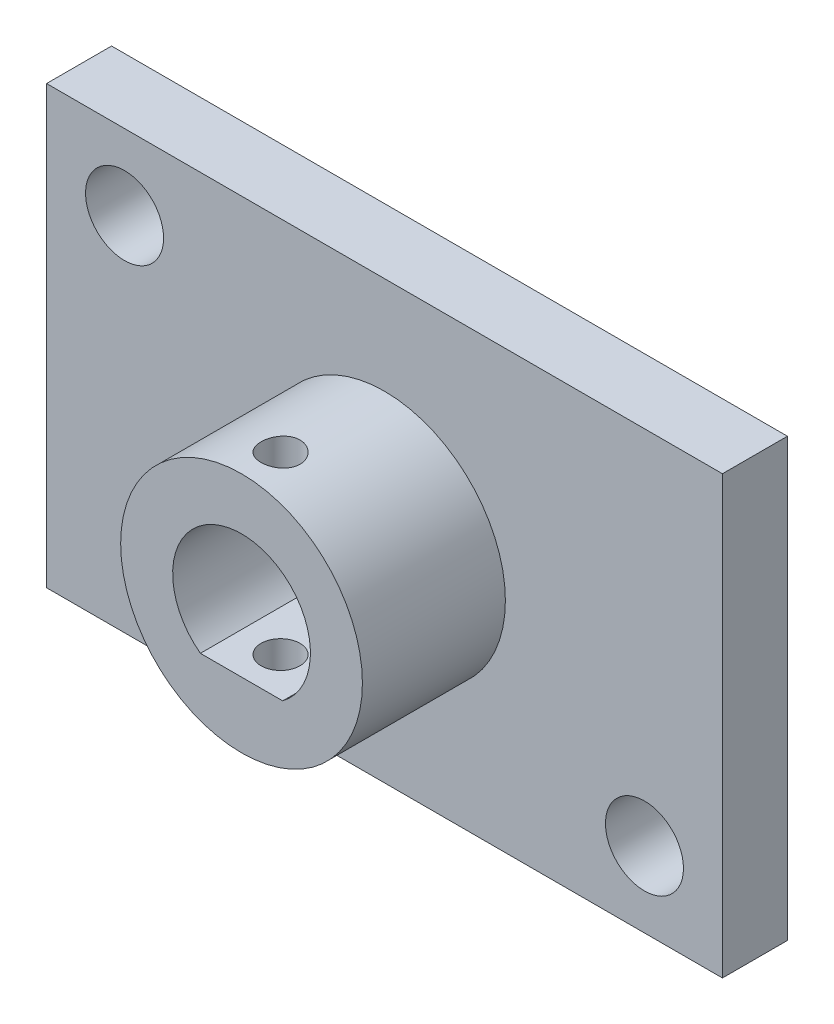
ISO-10303-21;
HEADER;
FILE_DESCRIPTION(('STEP AP214'),'2;1');
FILE_NAME('part.step','',(''),(''),'','','');
FILE_SCHEMA(('AUTOMOTIVE_DESIGN { 1 0 10303 214 1 1 1 1 }'));
ENDSEC;
DATA;
#1=APPLICATION_CONTEXT('core data for automotive mechanical design processes');
#2=APPLICATION_PROTOCOL_DEFINITION('international standard','automotive_design',2000,#1);
#3=PRODUCT_CONTEXT('',#1,'mechanical');
#4=PRODUCT('Part','Part','',(#3));
#5=PRODUCT_RELATED_PRODUCT_CATEGORY('part','',(#4));
#6=PRODUCT_DEFINITION_FORMATION('','',#4);
#7=PRODUCT_DEFINITION_CONTEXT('part definition',#1,'design');
#8=PRODUCT_DEFINITION('design','',#6,#7);
#9=PRODUCT_DEFINITION_SHAPE('','',#8);
#10=(LENGTH_UNIT() NAMED_UNIT(*) SI_UNIT(.MILLI.,.METRE.));
#11=(NAMED_UNIT(*) PLANE_ANGLE_UNIT() SI_UNIT($,.RADIAN.));
#12=(NAMED_UNIT(*) SI_UNIT($,.STERADIAN.) SOLID_ANGLE_UNIT());
#13=UNCERTAINTY_MEASURE_WITH_UNIT(LENGTH_MEASURE(1.E-05),#10,'distance_accuracy_value','');
#14=(GEOMETRIC_REPRESENTATION_CONTEXT(3) GLOBAL_UNCERTAINTY_ASSIGNED_CONTEXT((#13)) GLOBAL_UNIT_ASSIGNED_CONTEXT((#10,
#11,#12)) REPRESENTATION_CONTEXT('',''));
#15=CARTESIAN_POINT('',(0.,0.,0.));
#16=DIRECTION('',(0.,0.,1.));
#17=DIRECTION('',(1.,0.,0.));
#18=AXIS2_PLACEMENT_3D('',#15,#16,#17);
#19=CARTESIAN_POINT('',(0.,0.,16.));
#20=DIRECTION('',(0.,0.,-1.));
#21=DIRECTION('',(-1.,0.,0.));
#22=AXIS2_PLACEMENT_3D('',#19,#20,#21);
#23=CYLINDRICAL_SURFACE('',#22,9.3);
#24=CARTESIAN_POINT('',(0.,0.,16.));
#25=DIRECTION('',(0.,0.,1.));
#26=DIRECTION('',(1.,0.,0.));
#27=AXIS2_PLACEMENT_3D('',#24,#25,#26);
#28=CIRCLE('',#27,9.3);
#29=CARTESIAN_POINT('',(9.3,0.,16.));
#30=VERTEX_POINT('',#29);
#31=EDGE_CURVE('E129',#30,#30,#28,.T.);
#32=ORIENTED_EDGE('',*,*,#31,.F.);
#33=EDGE_LOOP('',(#32));
#34=FACE_BOUND('',#33,.T.);
#35=CARTESIAN_POINT('',(0.,0.,5.));
#36=DIRECTION('',(0.,0.,-1.));
#37=DIRECTION('',(-1.,0.,0.));
#38=AXIS2_PLACEMENT_3D('',#35,#36,#37);
#39=CIRCLE('',#38,9.3);
#40=CARTESIAN_POINT('',(-9.3,0.,5.));
#41=VERTEX_POINT('',#40);
#42=EDGE_CURVE('E11',#41,#41,#39,.F.);
#43=ORIENTED_EDGE('',*,*,#42,.T.);
#44=EDGE_LOOP('',(#43));
#45=FACE_BOUND('',#44,.T.);
#46=CARTESIAN_POINT('',(0.,-9.3,11.5));
#47=CARTESIAN_POINT('',(0.0836735793011216,-9.29999859385833,11.5000033884479));
#48=CARTESIAN_POINT('',(0.167393789264579,-9.29885897670419,11.5070249140576));
#49=CARTESIAN_POINT('',(0.332488782223381,-9.29442253700797,11.534915344581));
#50=CARTESIAN_POINT('',(0.413861291343729,-9.29112369183444,11.5557972332851));
#51=CARTESIAN_POINT('',(0.571848184014897,-9.28273904134878,11.6107637188957));
#52=CARTESIAN_POINT('',(0.648466305077085,-9.27765466116757,11.6448377886333));
#53=CARTESIAN_POINT('',(0.794887252807581,-9.26625890919944,11.7251944346405));
#54=CARTESIAN_POINT('',(0.864690912967219,-9.25994768775328,11.7714755152747));
#55=CARTESIAN_POINT('',(0.996138581858891,-9.24673526681386,11.8753746736587));
#56=CARTESIAN_POINT('',(1.0577125354843,-9.23982973506006,11.9330808398927));
#57=CARTESIAN_POINT('',(1.17034802780707,-9.2262403972841,12.0580025051985));
#58=CARTESIAN_POINT('',(1.22140892312839,-9.21955660485288,12.1252185858316));
#59=CARTESIAN_POINT('',(1.31184697004909,-9.20712553645536,12.2677298272258));
#60=CARTESIAN_POINT('',(1.35115533999119,-9.2013838591686,12.3430691679243));
#61=CARTESIAN_POINT('',(1.41653276736117,-9.19154691734372,12.499389238625));
#62=CARTESIAN_POINT('',(1.44260266097871,-9.18745154882223,12.580369611952));
#63=CARTESIAN_POINT('',(1.48054342072619,-9.18141387469345,12.7449322911882));
#64=CARTESIAN_POINT('',(1.49253490545377,-9.17945328974136,12.8284861046788));
#65=CARTESIAN_POINT('',(1.50235232787071,-9.17785180873546,12.9964411681746));
#66=CARTESIAN_POINT('',(1.50017920465472,-9.17821075889953,13.0808423616292));
#67=CARTESIAN_POINT('',(1.48182745348229,-9.18119109298899,13.2472383129354));
#68=CARTESIAN_POINT('',(1.46578393500658,-9.18379065074456,13.3292484195986));
#69=CARTESIAN_POINT('',(1.42035866531087,-9.19092515391558,13.4893973466998));
#70=CARTESIAN_POINT('',(1.39097648320891,-9.19546016185203,13.5675360419883));
#71=CARTESIAN_POINT('',(1.3195697791194,-9.20597833969638,13.7181307518003));
#72=CARTESIAN_POINT('',(1.27748877831558,-9.21196795533715,13.7905595173767));
#73=CARTESIAN_POINT('',(1.18191910192931,-9.22471593526973,13.9273790376238));
#74=CARTESIAN_POINT('',(1.12842956287033,-9.23147435773205,13.9917691832913));
#75=CARTESIAN_POINT('',(1.01082320444694,-9.24509453028026,14.1114660669227));
#76=CARTESIAN_POINT('',(0.946590381802285,-9.25195656998355,14.1666588582246));
#77=CARTESIAN_POINT('',(0.809714131221605,-9.26493826851478,14.2654995366036));
#78=CARTESIAN_POINT('',(0.737070655284634,-9.2710579231054,14.3091473577869));
#79=CARTESIAN_POINT('',(0.585330836278673,-9.28187322773442,14.3836679530014));
#80=CARTESIAN_POINT('',(0.50622967734846,-9.28656780246992,14.4145310866373));
#81=CARTESIAN_POINT('',(0.343874173775062,-9.2939952526251,14.4625027057449));
#82=CARTESIAN_POINT('',(0.260620154801669,-9.29672828161253,14.4796122679845));
#83=CARTESIAN_POINT('',(0.0933047616528914,-9.29990415622894,14.4994375832432));
#84=CARTESIAN_POINT('',(0.00926238718336536,-9.3003719012373,14.5023098371326));
#85=CARTESIAN_POINT('',(-0.158103109990812,-9.29903256340254,14.4939956278134));
#86=CARTESIAN_POINT('',(-0.241426258447816,-9.29722556235122,14.4828096700883));
#87=CARTESIAN_POINT('',(-0.404507784947462,-9.29155517684576,14.4468267278632));
#88=CARTESIAN_POINT('',(-0.48428360773335,-9.28770343989523,14.4221068125978));
#89=CARTESIAN_POINT('',(-0.638558576662488,-9.27837383644023,14.3598395256778));
#90=CARTESIAN_POINT('',(-0.713057442045781,-9.27289588349347,14.3222914721214));
#91=CARTESIAN_POINT('',(-0.855346337251176,-9.2608600781333,14.2350724176489));
#92=CARTESIAN_POINT('',(-0.92307539130148,-9.25429361999542,14.1853031511404));
#93=CARTESIAN_POINT('',(-1.04927600052989,-9.24083627927679,14.0751901550347));
#94=CARTESIAN_POINT('',(-1.10774692797209,-9.23394537473841,14.0148457089843));
#95=CARTESIAN_POINT('',(-1.21434807959858,-9.2205357936165,13.8845951077135));
#96=CARTESIAN_POINT('',(-1.26237283649665,-9.21402136106442,13.8146021297516));
#97=CARTESIAN_POINT('',(-1.34598298665685,-9.2021801991564,13.6674504671102));
#98=CARTESIAN_POINT('',(-1.381568755633,-9.19685343392926,13.5902919989503));
#99=CARTESIAN_POINT('',(-1.43913112413768,-9.18802220216516,13.4313010244675));
#100=CARTESIAN_POINT('',(-1.46116122047208,-9.18451058114791,13.3494883017735));
#101=CARTESIAN_POINT('',(-1.4911559068132,-9.17968892760149,13.18326265331));
#102=CARTESIAN_POINT('',(-1.49912163481837,-9.17837871694875,13.0988499384774));
#103=CARTESIAN_POINT('',(-1.50073127874477,-9.17811557029151,12.9308729621881));
#104=CARTESIAN_POINT('',(-1.49454114008717,-9.17913532065691,12.8473102870053));
#105=CARTESIAN_POINT('',(-1.46837252145517,-9.18335750162236,12.6824316622942));
#106=CARTESIAN_POINT('',(-1.4483940782071,-9.18655992640867,12.6011157067821));
#107=CARTESIAN_POINT('',(-1.39527792756287,-9.19477651945459,12.443096906211));
#108=CARTESIAN_POINT('',(-1.36215361491953,-9.19978884308236,12.3663894567157));
#109=CARTESIAN_POINT('',(-1.28370285211221,-9.2110624018918,12.2195937272761));
#110=CARTESIAN_POINT('',(-1.23837586013687,-9.21732369252566,12.1495057414294));
#111=CARTESIAN_POINT('',(-1.13621057535918,-9.23047670265515,12.0170984706212));
#112=CARTESIAN_POINT('',(-1.07924991358056,-9.23737465679611,11.9548742120561));
#113=CARTESIAN_POINT('',(-0.955692553697377,-9.25097327240481,11.8408097591155));
#114=CARTESIAN_POINT('',(-0.889093630312256,-9.25767388787988,11.788971969375));
#115=CARTESIAN_POINT('',(-0.747642902025416,-9.27017255130206,11.6968494691597));
#116=CARTESIAN_POINT('',(-0.672740796528902,-9.27596452029542,11.6566411685407));
#117=CARTESIAN_POINT('',(-0.517184406152423,-9.28593403732716,11.5894383470758));
#118=CARTESIAN_POINT('',(-0.436536021495505,-9.290113213854,11.5624304899323));
#119=CARTESIAN_POINT('',(-0.296298047913879,-9.29546020067674,11.5283461344465));
#120=CARTESIAN_POINT('',(-0.237562831713886,-9.29715364549993,11.5177330955892));
#121=CARTESIAN_POINT('',(-0.119226294154582,-9.29942403749799,11.5035588758074));
#122=CARTESIAN_POINT('',(-0.0596249862533232,-9.30000100200301,11.4999975854247));
#123=CARTESIAN_POINT('',(0.,-9.3,11.5));
#124=B_SPLINE_CURVE_WITH_KNOTS('',3,(#46,#47,#48,#49,#50,#51,#52,#53,#54,#55,#56,#57,#58,#59,
#60,#61,#62,#63,#64,#65,#66,#67,#68,#69,#70,#71,#72,#73,#74,#75,#76,#77,#78,#79,#80,#81,#82,#83,
#84,#85,#86,#87,#88,#89,#90,#91,#92,#93,#94,#95,#96,#97,#98,#99,#100,#101,#102,#103,#104,#105,
#106,#107,#108,#109,#110,#111,#112,#113,#114,#115,#116,#117,#118,#119,#120,#121,#122,#123),
.UNSPECIFIED.,.T.,.F.,(4,2,2,2,2,2,2,2,2,2,2,2,2,2,2,2,2,2,2,2,2,2,2,2,2,2,2,2,2,2,2,2,2,2,2,2,
2,2,4),(0.,0.250802815109544,0.501840903682446,0.752679079031154,1.00348653528363,
1.25630884295433,1.50914661819806,1.76343639594985,2.01771010984887,2.26978902372094,
2.52185122526657,2.77148544083258,3.02112772096482,3.27189708786835,3.5226854414596,
3.77638091962226,4.03007784573706,4.28396572732141,4.5378337300703,4.78890485209679,
5.03996694675492,5.28961401576336,5.53927435725609,5.79101191266997,6.0427665295371,
6.29695572621149,6.55113724455215,6.80430910404753,7.05746047756159,7.30765945997417,
7.55785777596269,7.80780180862423,8.05775694088566,8.31049081728847,8.563283138222,
8.81770050681354,9.07186030561202,9.25058274886382,9.42930241794102),.UNSPECIFIED.);
#125=CARTESIAN_POINT('',(0.,-9.3,11.5));
#126=VERTEX_POINT('',#125);
#127=EDGE_CURVE('E192',#126,#126,#124,.T.);
#128=ORIENTED_EDGE('',*,*,#127,.F.);
#129=EDGE_LOOP('',(#128));
#130=FACE_BOUND('',#129,.T.);
#131=CARTESIAN_POINT('',(0.,9.3,11.5));
#132=CARTESIAN_POINT('',(-0.0836735793011216,9.29999859385833,11.5000033884479));
#133=CARTESIAN_POINT('',(-0.167393789264579,9.29885897670419,11.5070249140576));
#134=CARTESIAN_POINT('',(-0.332488782223381,9.29442253700797,11.534915344581));
#135=CARTESIAN_POINT('',(-0.413861291343729,9.29112369183444,11.5557972332851));
#136=CARTESIAN_POINT('',(-0.571848184014897,9.28273904134878,11.6107637188957));
#137=CARTESIAN_POINT('',(-0.648466305077085,9.27765466116757,11.6448377886333));
#138=CARTESIAN_POINT('',(-0.794887252807581,9.26625890919944,11.7251944346405));
#139=CARTESIAN_POINT('',(-0.864690912967219,9.25994768775328,11.7714755152747));
#140=CARTESIAN_POINT('',(-0.996138581858891,9.24673526681386,11.8753746736587));
#141=CARTESIAN_POINT('',(-1.0577125354843,9.23982973506006,11.9330808398927));
#142=CARTESIAN_POINT('',(-1.17034802780707,9.2262403972841,12.0580025051985));
#143=CARTESIAN_POINT('',(-1.22140892312839,9.21955660485288,12.1252185858316));
#144=CARTESIAN_POINT('',(-1.31184697004909,9.20712553645536,12.2677298272258));
#145=CARTESIAN_POINT('',(-1.35115533999119,9.2013838591686,12.3430691679243));
#146=CARTESIAN_POINT('',(-1.41653276736117,9.19154691734372,12.499389238625));
#147=CARTESIAN_POINT('',(-1.44260266097871,9.18745154882223,12.580369611952));
#148=CARTESIAN_POINT('',(-1.48054342072619,9.18141387469345,12.7449322911882));
#149=CARTESIAN_POINT('',(-1.49253490545377,9.17945328974136,12.8284861046788));
#150=CARTESIAN_POINT('',(-1.50235232787071,9.17785180873546,12.9964411681746));
#151=CARTESIAN_POINT('',(-1.50017920465472,9.17821075889953,13.0808423616292));
#152=CARTESIAN_POINT('',(-1.48182745348229,9.18119109298899,13.2472383129354));
#153=CARTESIAN_POINT('',(-1.46578393500658,9.18379065074456,13.3292484195986));
#154=CARTESIAN_POINT('',(-1.42035866531087,9.19092515391558,13.4893973466998));
#155=CARTESIAN_POINT('',(-1.39097648320891,9.19546016185203,13.5675360419883));
#156=CARTESIAN_POINT('',(-1.3195697791194,9.20597833969638,13.7181307518003));
#157=CARTESIAN_POINT('',(-1.27748877831558,9.21196795533715,13.7905595173767));
#158=CARTESIAN_POINT('',(-1.18191910192931,9.22471593526973,13.9273790376238));
#159=CARTESIAN_POINT('',(-1.12842956287033,9.23147435773205,13.9917691832913));
#160=CARTESIAN_POINT('',(-1.01082320444694,9.24509453028026,14.1114660669227));
#161=CARTESIAN_POINT('',(-0.946590381802285,9.25195656998355,14.1666588582246));
#162=CARTESIAN_POINT('',(-0.809714131221605,9.26493826851478,14.2654995366036));
#163=CARTESIAN_POINT('',(-0.737070655284634,9.2710579231054,14.3091473577869));
#164=CARTESIAN_POINT('',(-0.585330836278673,9.28187322773442,14.3836679530014));
#165=CARTESIAN_POINT('',(-0.50622967734846,9.28656780246992,14.4145310866373));
#166=CARTESIAN_POINT('',(-0.343874173775062,9.2939952526251,14.4625027057449));
#167=CARTESIAN_POINT('',(-0.260620154801669,9.29672828161253,14.4796122679845));
#168=CARTESIAN_POINT('',(-0.0933047616528914,9.29990415622894,14.4994375832432));
#169=CARTESIAN_POINT('',(-0.00926238718336536,9.3003719012373,14.5023098371326));
#170=CARTESIAN_POINT('',(0.158103109990812,9.29903256340254,14.4939956278134));
#171=CARTESIAN_POINT('',(0.241426258447816,9.29722556235122,14.4828096700883));
#172=CARTESIAN_POINT('',(0.404507784947462,9.29155517684576,14.4468267278632));
#173=CARTESIAN_POINT('',(0.48428360773335,9.28770343989523,14.4221068125978));
#174=CARTESIAN_POINT('',(0.638558576662488,9.27837383644023,14.3598395256778));
#175=CARTESIAN_POINT('',(0.713057442045781,9.27289588349347,14.3222914721214));
#176=CARTESIAN_POINT('',(0.855346337251176,9.2608600781333,14.2350724176489));
#177=CARTESIAN_POINT('',(0.92307539130148,9.25429361999542,14.1853031511404));
#178=CARTESIAN_POINT('',(1.04927600052989,9.24083627927679,14.0751901550347));
#179=CARTESIAN_POINT('',(1.10774692797209,9.23394537473841,14.0148457089843));
#180=CARTESIAN_POINT('',(1.21434807959858,9.2205357936165,13.8845951077135));
#181=CARTESIAN_POINT('',(1.26237283649665,9.21402136106442,13.8146021297516));
#182=CARTESIAN_POINT('',(1.34598298665685,9.2021801991564,13.6674504671102));
#183=CARTESIAN_POINT('',(1.381568755633,9.19685343392926,13.5902919989503));
#184=CARTESIAN_POINT('',(1.43913112413768,9.18802220216516,13.4313010244675));
#185=CARTESIAN_POINT('',(1.46116122047208,9.18451058114791,13.3494883017735));
#186=CARTESIAN_POINT('',(1.4911559068132,9.17968892760149,13.18326265331));
#187=CARTESIAN_POINT('',(1.49912163481837,9.17837871694875,13.0988499384774));
#188=CARTESIAN_POINT('',(1.50073127874477,9.17811557029151,12.9308729621881));
#189=CARTESIAN_POINT('',(1.49454114008717,9.17913532065691,12.8473102870053));
#190=CARTESIAN_POINT('',(1.46837252145517,9.18335750162236,12.6824316622942));
#191=CARTESIAN_POINT('',(1.4483940782071,9.18655992640867,12.6011157067821));
#192=CARTESIAN_POINT('',(1.39527792756287,9.19477651945459,12.443096906211));
#193=CARTESIAN_POINT('',(1.36215361491953,9.19978884308236,12.3663894567157));
#194=CARTESIAN_POINT('',(1.28370285211221,9.2110624018918,12.2195937272761));
#195=CARTESIAN_POINT('',(1.23837586013687,9.21732369252566,12.1495057414294));
#196=CARTESIAN_POINT('',(1.13621057535918,9.23047670265515,12.0170984706212));
#197=CARTESIAN_POINT('',(1.07924991358056,9.23737465679611,11.9548742120561));
#198=CARTESIAN_POINT('',(0.955692553697377,9.25097327240481,11.8408097591155));
#199=CARTESIAN_POINT('',(0.889093630312256,9.25767388787988,11.788971969375));
#200=CARTESIAN_POINT('',(0.747642902025416,9.27017255130206,11.6968494691597));
#201=CARTESIAN_POINT('',(0.672740796528902,9.27596452029542,11.6566411685407));
#202=CARTESIAN_POINT('',(0.517184406152423,9.28593403732716,11.5894383470758));
#203=CARTESIAN_POINT('',(0.436536021495505,9.290113213854,11.5624304899323));
#204=CARTESIAN_POINT('',(0.296298047913879,9.29546020067674,11.5283461344465));
#205=CARTESIAN_POINT('',(0.237562831713886,9.29715364549993,11.5177330955892));
#206=CARTESIAN_POINT('',(0.119226294154582,9.29942403749799,11.5035588758074));
#207=CARTESIAN_POINT('',(0.0596249862533232,9.30000100200301,11.4999975854247));
#208=CARTESIAN_POINT('',(0.,9.3,11.5));
#209=B_SPLINE_CURVE_WITH_KNOTS('',3,(#131,#132,#133,#134,#135,#136,#137,#138,#139,#140,#141,
#142,#143,#144,#145,#146,#147,#148,#149,#150,#151,#152,#153,#154,#155,#156,#157,#158,#159,#160,
#161,#162,#163,#164,#165,#166,#167,#168,#169,#170,#171,#172,#173,#174,#175,#176,#177,#178,#179,
#180,#181,#182,#183,#184,#185,#186,#187,#188,#189,#190,#191,#192,#193,#194,#195,#196,#197,#198,
#199,#200,#201,#202,#203,#204,#205,#206,#207,#208),.UNSPECIFIED.,.T.,.F.,(4,2,2,2,2,2,2,2,2,2,2,
2,2,2,2,2,2,2,2,2,2,2,2,2,2,2,2,2,2,2,2,2,2,2,2,2,2,2,4),(0.,0.250802815109544,
0.501840903682446,0.752679079031154,1.00348653528363,1.25630884295433,1.50914661819806,
1.76343639594985,2.01771010984887,2.26978902372094,2.52185122526657,2.77148544083258,
3.02112772096482,3.27189708786835,3.5226854414596,3.77638091962226,4.03007784573706,
4.28396572732141,4.5378337300703,4.78890485209679,5.03996694675492,5.28961401576336,
5.53927435725609,5.79101191266997,6.0427665295371,6.29695572621149,6.55113724455215,
6.80430910404753,7.05746047756159,7.30765945997417,7.55785777596269,7.80780180862423,
8.05775694088566,8.31049081728847,8.563283138222,8.81770050681354,9.07186030561202,
9.25058274886382,9.42930241794102),.UNSPECIFIED.);
#210=CARTESIAN_POINT('',(0.,9.3,11.5));
#211=VERTEX_POINT('',#210);
#212=EDGE_CURVE('E119',#211,#211,#209,.T.);
#213=ORIENTED_EDGE('',*,*,#212,.F.);
#214=EDGE_LOOP('',(#213));
#215=FACE_BOUND('',#214,.T.);
#216=ADVANCED_FACE('F36',(#34,#45,#130,#215),#23,.T.);
#217=CARTESIAN_POINT('',(0.,0.,16.));
#218=DIRECTION('',(0.,0.,-1.));
#219=DIRECTION('',(-1.,0.,0.));
#220=AXIS2_PLACEMENT_3D('',#217,#218,#219);
#221=CYLINDRICAL_SURFACE('',#220,5.3);
#222=CARTESIAN_POINT('',(0.,0.,5.));
#223=DIRECTION('',(0.,0.,1.));
#224=DIRECTION('',(1.,0.,0.));
#225=AXIS2_PLACEMENT_3D('',#222,#223,#224);
#226=CIRCLE('',#225,5.3);
#227=CARTESIAN_POINT('',(3.1666228067138,-4.25,5.));
#228=VERTEX_POINT('',#227);
#229=CARTESIAN_POINT('',(-3.1666228067138,-4.25,5.));
#230=VERTEX_POINT('',#229);
#231=EDGE_CURVE('E111',#228,#230,#226,.T.);
#232=ORIENTED_EDGE('',*,*,#231,.F.);
#233=DIRECTION('',(0.,0.,-1.));
#234=VECTOR('',#233,1.);
#235=CARTESIAN_POINT('',(3.1666228067138,-4.25,16.));
#236=LINE('',#235,#234);
#237=CARTESIAN_POINT('',(3.1666228067138,-4.25,16.));
#238=VERTEX_POINT('',#237);
#239=EDGE_CURVE('E52',#238,#228,#236,.T.);
#240=ORIENTED_EDGE('',*,*,#239,.F.);
#241=CARTESIAN_POINT('',(0.,0.,16.));
#242=DIRECTION('',(0.,0.,1.));
#243=DIRECTION('',(1.,0.,0.));
#244=AXIS2_PLACEMENT_3D('',#241,#242,#243);
#245=CIRCLE('',#244,5.3);
#246=CARTESIAN_POINT('',(-3.1666228067138,-4.25,16.));
#247=VERTEX_POINT('',#246);
#248=EDGE_CURVE('E105',#238,#247,#245,.T.);
#249=ORIENTED_EDGE('',*,*,#248,.T.);
#250=DIRECTION('',(0.,0.,-1.));
#251=VECTOR('',#250,1.);
#252=CARTESIAN_POINT('',(-3.1666228067138,-4.25,16.));
#253=LINE('',#252,#251);
#254=EDGE_CURVE('E101',#247,#230,#253,.T.);
#255=ORIENTED_EDGE('',*,*,#254,.T.);
#256=EDGE_LOOP('',(#232,#240,#249,#255));
#257=FACE_BOUND('',#256,.T.);
#258=CARTESIAN_POINT('',(0.,5.3,11.5));
#259=CARTESIAN_POINT('',(-0.0824988189405399,5.29999897563444,11.5000015332446));
#260=CARTESIAN_POINT('',(-0.165013483554055,5.29805505585777,11.5068287652269));
#261=CARTESIAN_POINT('',(-0.32765335546333,5.29048966917513,11.533901157585));
#262=CARTESIAN_POINT('',(-0.407777610094405,5.28486675599983,11.554151594872));
#263=CARTESIAN_POINT('',(-0.563266444254526,5.27056186834204,11.6073499543523));
#264=CARTESIAN_POINT('',(-0.638637421981466,5.26188411417403,11.6402803648062));
#265=CARTESIAN_POINT('',(-0.782787570176938,5.24237935327288,11.7178356498006));
#266=CARTESIAN_POINT('',(-0.851566085502377,5.23155213325867,11.7624616849821));
#267=CARTESIAN_POINT('',(-0.982356300385496,5.20859782941969,11.8633579774133));
#268=CARTESIAN_POINT('',(-1.04417344129311,5.19644637246721,11.9198748887293));
#269=CARTESIAN_POINT('',(-1.15759098946668,5.17236423407496,12.0424221417838));
#270=CARTESIAN_POINT('',(-1.20918989767466,5.16043358526108,12.108453876936));
#271=CARTESIAN_POINT('',(-1.30169044992506,5.13789059993899,12.2497536604371));
#272=CARTESIAN_POINT('',(-1.34236178833266,5.12730880036636,12.3251778003922));
#273=CARTESIAN_POINT('',(-1.41036676208713,5.10902284411776,12.4821422218404));
#274=CARTESIAN_POINT('',(-1.43770320631829,5.10131808149821,12.5636812111131));
#275=CARTESIAN_POINT('',(-1.47757433986073,5.08991132868807,12.7283911609711));
#276=CARTESIAN_POINT('',(-1.4904646774082,5.08611336045563,12.8114692137567));
#277=CARTESIAN_POINT('',(-1.50218738204673,5.08266403162307,12.9786888162661));
#278=CARTESIAN_POINT('',(-1.50102274046838,5.08301178868529,13.062830135886));
#279=CARTESIAN_POINT('',(-1.48494945312453,5.08772911316821,13.226957593667));
#280=CARTESIAN_POINT('',(-1.47047825443794,5.09197066654704,13.3069908476434));
#281=CARTESIAN_POINT('',(-1.42890619012241,5.10379168143764,13.4634439925307));
#282=CARTESIAN_POINT('',(-1.40180420194608,5.11137143962536,13.5398635616142));
#283=CARTESIAN_POINT('',(-1.33539997780266,5.12912236189303,13.6880266305909));
#284=CARTESIAN_POINT('',(-1.29594990861932,5.13932464348996,13.7596999876951));
#285=CARTESIAN_POINT('',(-1.20607228735807,5.16115519630252,13.8955597901532));
#286=CARTESIAN_POINT('',(-1.15564233194633,5.17278377947063,13.9597445916421));
#287=CARTESIAN_POINT('',(-1.04303028932748,5.19668306000604,14.0812962267398));
#288=CARTESIAN_POINT('',(-0.980482858039994,5.20896160817823,14.1383235696527));
#289=CARTESIAN_POINT('',(-0.846560453238892,5.23239427785434,14.2411538390909));
#290=CARTESIAN_POINT('',(-0.775185039436267,5.24354834322512,14.2869562054388));
#291=CARTESIAN_POINT('',(-0.625063672950517,5.26355894787025,14.3662124146763));
#292=CARTESIAN_POINT('',(-0.546279995122364,5.27240275322058,14.399598229157));
#293=CARTESIAN_POINT('',(-0.383909229132418,5.28670459606185,14.4525497349562));
#294=CARTESIAN_POINT('',(-0.300323333665067,5.29216347030734,14.4721188419291));
#295=CARTESIAN_POINT('',(-0.1336127190191,5.29895105530946,14.4963331199788));
#296=CARTESIAN_POINT('',(-0.0505600251315923,5.30040725842464,14.5014391342098));
#297=CARTESIAN_POINT('',(0.115217384552068,5.29939554287346,14.4978640225688));
#298=CARTESIAN_POINT('',(0.197942137754004,5.29692808546218,14.489184517286));
#299=CARTESIAN_POINT('',(0.359025498346586,5.28842922343849,14.4586603918493));
#300=CARTESIAN_POINT('',(0.437438027487941,5.28246903030844,14.4370786556846));
#301=CARTESIAN_POINT('',(0.589517646043254,5.2676666108454,14.3816732037579));
#302=CARTESIAN_POINT('',(0.663184190027718,5.25882405396359,14.3478480838781));
#303=CARTESIAN_POINT('',(0.805426285551588,5.23894646088651,14.2681003612948));
#304=CARTESIAN_POINT('',(0.87385947448097,5.22786862583406,14.2219347778315));
#305=CARTESIAN_POINT('',(1.00216727118293,5.20479755561364,14.1191170479183));
#306=CARTESIAN_POINT('',(1.0620399636904,5.1928041165127,14.0624625612415));
#307=CARTESIAN_POINT('',(1.17351174886732,5.16877453426037,13.938116196029));
#308=CARTESIAN_POINT('',(1.22478417496181,5.15674934191422,13.8701287669643));
#309=CARTESIAN_POINT('',(1.31520702433024,5.13443352058507,13.7262561200925));
#310=CARTESIAN_POINT('',(1.35435788475561,5.12414282905523,13.6503711872323));
#311=CARTESIAN_POINT('',(1.41913858282561,5.10658135337681,13.4931836148277));
#312=CARTESIAN_POINT('',(1.44484133202899,5.09929433093027,13.4119129393852));
#313=CARTESIAN_POINT('',(1.48213777217421,5.08858048954196,13.2459573566259));
#314=CARTESIAN_POINT('',(1.49373563837353,5.08515252828238,13.1612734673439));
#315=CARTESIAN_POINT('',(1.5022313794356,5.08264869945619,12.9942624388841));
#316=CARTESIAN_POINT('',(1.49965769100532,5.08341637457008,12.9119641493607));
#317=CARTESIAN_POINT('',(1.48112616488821,5.08884628598401,12.7490261096468));
#318=CARTESIAN_POINT('',(1.46516875822772,5.09350839686264,12.66838630613));
#319=CARTESIAN_POINT('',(1.42064634872933,5.10610293658764,12.5118138642321));
#320=CARTESIAN_POINT('',(1.39220664848377,5.11400281247246,12.4358427881292));
#321=CARTESIAN_POINT('',(1.32362384919927,5.13218012125169,12.289690771029));
#322=CARTESIAN_POINT('',(1.28347871156193,5.14245796822492,12.2195108413413));
#323=CARTESIAN_POINT('',(1.19107941633252,5.16465433409836,12.0844440416426));
#324=CARTESIAN_POINT('',(1.13847110687821,5.17661562662278,12.0198064595221));
#325=CARTESIAN_POINT('',(1.02329507219002,5.20060784519651,11.9001053240978));
#326=CARTESIAN_POINT('',(0.960724856143911,5.21263878793382,11.8450441724476));
#327=CARTESIAN_POINT('',(0.825513752178018,5.23577516718698,11.7446952820013));
#328=CARTESIAN_POINT('',(0.752660088710004,5.24684992137466,11.6996864995452));
#329=CARTESIAN_POINT('',(0.600106846147284,5.26647598639022,11.6226238939818));
#330=CARTESIAN_POINT('',(0.520411135154313,5.27502871105693,11.5905628087119));
#331=CARTESIAN_POINT('',(0.367660165939791,5.28771017451885,11.5438718644501));
#332=CARTESIAN_POINT('',(0.295181563370487,5.29228317727944,11.5274610666946));
#333=CARTESIAN_POINT('',(0.14847276760399,5.29842835855758,11.5055251424701));
#334=CARTESIAN_POINT('',(0.0742428002387584,5.3000009218528,11.4999986201939));
#335=CARTESIAN_POINT('',(0.,5.3,11.5));
#336=B_SPLINE_CURVE_WITH_KNOTS('',3,(#258,#259,#260,#261,#262,#263,#264,#265,#266,#267,#268,
#269,#270,#271,#272,#273,#274,#275,#276,#277,#278,#279,#280,#281,#282,#283,#284,#285,#286,#287,
#288,#289,#290,#291,#292,#293,#294,#295,#296,#297,#298,#299,#300,#301,#302,#303,#304,#305,#306,
#307,#308,#309,#310,#311,#312,#313,#314,#315,#316,#317,#318,#319,#320,#321,#322,#323,#324,#325,
#326,#327,#328,#329,#330,#331,#332,#333,#334,#335),.UNSPECIFIED.,.T.,.F.,(4,2,2,2,2,2,2,2,2,2,2,
2,2,2,2,2,2,2,2,2,2,2,2,2,2,2,2,2,2,2,2,2,2,2,2,2,2,2,4),(0.,0.247223980184208,
0.494545206387399,0.741526086420405,0.988531485428155,1.24128102647917,1.49406761953319,
1.75182506243826,2.00952818741672,2.26073712169947,2.51189259196004,2.75507567702131,
2.99828037883178,3.24451595474457,3.49080548224541,3.74619402544606,4.001595311099,
4.25837597817172,4.51509314376359,4.76353307269698,5.01194379785304,5.25545783772582,
5.49899981356432,5.74774410261743,5.99654395716971,6.2533177714784,6.51008232443232,
6.76543996316419,7.02072199378158,7.26655094437427,7.51237197828162,7.75577986415623,
7.99923016686696,8.25066989843933,8.50217259743232,8.7599670357204,9.01761667961373,
9.24012840854437,9.46261160055559),.UNSPECIFIED.);
#337=CARTESIAN_POINT('',(0.,5.3,11.5));
#338=VERTEX_POINT('',#337);
#339=EDGE_CURVE('E196',#338,#338,#336,.T.);
#340=ORIENTED_EDGE('',*,*,#339,.T.);
#341=EDGE_LOOP('',(#340));
#342=FACE_BOUND('',#341,.T.);
#343=ADVANCED_FACE('F108',(#257,#342),#221,.F.);
#344=CARTESIAN_POINT('',(0.,0.,5.));
#345=DIRECTION('',(0.,0.,-1.));
#346=DIRECTION('',(-1.,0.,0.));
#347=AXIS2_PLACEMENT_3D('',#344,#345,#346);
#348=PLANE('',#347);
#349=CARTESIAN_POINT('',(-20.,11.,5.));
#350=DIRECTION('',(0.,0.,1.));
#351=DIRECTION('',(1.,0.,0.));
#352=AXIS2_PLACEMENT_3D('',#349,#350,#351);
#353=CIRCLE('',#352,3.);
#354=CARTESIAN_POINT('',(-17.,11.,5.));
#355=VERTEX_POINT('',#354);
#356=EDGE_CURVE('E137',#355,#355,#353,.T.);
#357=ORIENTED_EDGE('',*,*,#356,.F.);
#358=EDGE_LOOP('',(#357));
#359=FACE_BOUND('',#358,.T.);
#360=CARTESIAN_POINT('',(20.,-11.,5.));
#361=DIRECTION('',(0.,0.,1.));
#362=DIRECTION('',(1.,0.,0.));
#363=AXIS2_PLACEMENT_3D('',#360,#361,#362);
#364=CIRCLE('',#363,3.);
#365=CARTESIAN_POINT('',(23.,-11.,5.));
#366=VERTEX_POINT('',#365);
#367=EDGE_CURVE('E132',#366,#366,#364,.T.);
#368=ORIENTED_EDGE('',*,*,#367,.F.);
#369=EDGE_LOOP('',(#368));
#370=FACE_BOUND('',#369,.T.);
#371=DIRECTION('',(0.,1.,0.));
#372=VECTOR('',#371,1.);
#373=CARTESIAN_POINT('',(26.,-16.8,5.));
#374=LINE('',#373,#372);
#375=CARTESIAN_POINT('',(26.,-16.8,5.));
#376=VERTEX_POINT('',#375);
#377=CARTESIAN_POINT('',(26.,16.8,5.));
#378=VERTEX_POINT('',#377);
#379=EDGE_CURVE('E145',#376,#378,#374,.T.);
#380=ORIENTED_EDGE('',*,*,#379,.T.);
#381=DIRECTION('',(-1.,0.,0.));
#382=VECTOR('',#381,1.);
#383=CARTESIAN_POINT('',(-26.,16.8,5.));
#384=LINE('',#383,#382);
#385=CARTESIAN_POINT('',(-26.,16.8,5.));
#386=VERTEX_POINT('',#385);
#387=EDGE_CURVE('E90',#378,#386,#384,.T.);
#388=ORIENTED_EDGE('',*,*,#387,.T.);
#389=DIRECTION('',(0.,-1.,0.));
#390=VECTOR('',#389,1.);
#391=CARTESIAN_POINT('',(-26.,-16.8,5.));
#392=LINE('',#391,#390);
#393=CARTESIAN_POINT('',(-26.,-16.8,5.));
#394=VERTEX_POINT('',#393);
#395=EDGE_CURVE('E148',#386,#394,#392,.T.);
#396=ORIENTED_EDGE('',*,*,#395,.T.);
#397=DIRECTION('',(1.,0.,0.));
#398=VECTOR('',#397,1.);
#399=CARTESIAN_POINT('',(-26.,-16.8,5.));
#400=LINE('',#399,#398);
#401=EDGE_CURVE('E61',#394,#376,#400,.T.);
#402=ORIENTED_EDGE('',*,*,#401,.T.);
#403=EDGE_LOOP('',(#380,#388,#396,#402));
#404=FACE_BOUND('',#403,.T.);
#405=ORIENTED_EDGE('',*,*,#42,.F.);
#406=EDGE_LOOP('',(#405));
#407=FACE_BOUND('',#406,.T.);
#408=ADVANCED_FACE('F178',(#359,#370,#404,#407),#348,.F.);
#409=CARTESIAN_POINT('',(26.,-16.8,5.));
#410=DIRECTION('',(-1.,0.,0.));
#411=DIRECTION('',(0.,0.,1.));
#412=AXIS2_PLACEMENT_3D('',#409,#410,#411);
#413=PLANE('',#412);
#414=DIRECTION('',(0.,1.,0.));
#415=VECTOR('',#414,1.);
#416=CARTESIAN_POINT('',(26.,-16.8,0.));
#417=LINE('',#416,#415);
#418=CARTESIAN_POINT('',(26.,-16.8,0.));
#419=VERTEX_POINT('',#418);
#420=CARTESIAN_POINT('',(26.,16.8,0.));
#421=VERTEX_POINT('',#420);
#422=EDGE_CURVE('E136',#419,#421,#417,.T.);
#423=ORIENTED_EDGE('',*,*,#422,.T.);
#424=DIRECTION('',(0.,0.,-1.));
#425=VECTOR('',#424,1.);
#426=CARTESIAN_POINT('',(26.,16.8,5.));
#427=LINE('',#426,#425);
#428=EDGE_CURVE('E45',#378,#421,#427,.T.);
#429=ORIENTED_EDGE('',*,*,#428,.F.);
#430=ORIENTED_EDGE('',*,*,#379,.F.);
#431=DIRECTION('',(0.,0.,-1.));
#432=VECTOR('',#431,1.);
#433=CARTESIAN_POINT('',(26.,-16.8,5.));
#434=LINE('',#433,#432);
#435=EDGE_CURVE('E151',#376,#419,#434,.T.);
#436=ORIENTED_EDGE('',*,*,#435,.T.);
#437=EDGE_LOOP('',(#423,#429,#430,#436));
#438=FACE_BOUND('',#437,.T.);
#439=ADVANCED_FACE('F38',(#438),#413,.F.);
#440=CARTESIAN_POINT('',(-26.,16.8,5.));
#441=DIRECTION('',(0.,-1.,0.));
#442=DIRECTION('',(0.,0.,-1.));
#443=AXIS2_PLACEMENT_3D('',#440,#441,#442);
#444=PLANE('',#443);
#445=DIRECTION('',(-1.,0.,0.));
#446=VECTOR('',#445,1.);
#447=CARTESIAN_POINT('',(-26.,16.8,0.));
#448=LINE('',#447,#446);
#449=CARTESIAN_POINT('',(-26.,16.8,0.));
#450=VERTEX_POINT('',#449);
#451=EDGE_CURVE('E154',#421,#450,#448,.T.);
#452=ORIENTED_EDGE('',*,*,#451,.T.);
#453=DIRECTION('',(0.,0.,-1.));
#454=VECTOR('',#453,1.);
#455=CARTESIAN_POINT('',(-26.,16.8,5.));
#456=LINE('',#455,#454);
#457=EDGE_CURVE('E162',#386,#450,#456,.T.);
#458=ORIENTED_EDGE('',*,*,#457,.F.);
#459=ORIENTED_EDGE('',*,*,#387,.F.);
#460=ORIENTED_EDGE('',*,*,#428,.T.);
#461=EDGE_LOOP('',(#452,#458,#459,#460));
#462=FACE_BOUND('',#461,.T.);
#463=ADVANCED_FACE('F166',(#462),#444,.F.);
#464=CARTESIAN_POINT('',(-26.,-16.8,5.));
#465=DIRECTION('',(1.,0.,0.));
#466=DIRECTION('',(0.,0.,-1.));
#467=AXIS2_PLACEMENT_3D('',#464,#465,#466);
#468=PLANE('',#467);
#469=DIRECTION('',(0.,-1.,0.));
#470=VECTOR('',#469,1.);
#471=CARTESIAN_POINT('',(-26.,-16.8,0.));
#472=LINE('',#471,#470);
#473=CARTESIAN_POINT('',(-26.,-16.8,0.));
#474=VERTEX_POINT('',#473);
#475=EDGE_CURVE('E156',#450,#474,#472,.T.);
#476=ORIENTED_EDGE('',*,*,#475,.T.);
#477=DIRECTION('',(0.,0.,-1.));
#478=VECTOR('',#477,1.);
#479=CARTESIAN_POINT('',(-26.,-16.8,5.));
#480=LINE('',#479,#478);
#481=EDGE_CURVE('E160',#394,#474,#480,.T.);
#482=ORIENTED_EDGE('',*,*,#481,.F.);
#483=ORIENTED_EDGE('',*,*,#395,.F.);
#484=ORIENTED_EDGE('',*,*,#457,.T.);
#485=EDGE_LOOP('',(#476,#482,#483,#484));
#486=FACE_BOUND('',#485,.T.);
#487=ADVANCED_FACE('F175',(#486),#468,.F.);
#488=CARTESIAN_POINT('',(-26.,-16.8,5.));
#489=DIRECTION('',(0.,1.,0.));
#490=DIRECTION('',(0.,0.,1.));
#491=AXIS2_PLACEMENT_3D('',#488,#489,#490);
#492=PLANE('',#491);
#493=DIRECTION('',(1.,0.,0.));
#494=VECTOR('',#493,1.);
#495=CARTESIAN_POINT('',(-26.,-16.8,0.));
#496=LINE('',#495,#494);
#497=EDGE_CURVE('E82',#474,#419,#496,.T.);
#498=ORIENTED_EDGE('',*,*,#497,.T.);
#499=ORIENTED_EDGE('',*,*,#435,.F.);
#500=ORIENTED_EDGE('',*,*,#401,.F.);
#501=ORIENTED_EDGE('',*,*,#481,.T.);
#502=EDGE_LOOP('',(#498,#499,#500,#501));
#503=FACE_BOUND('',#502,.T.);
#504=ADVANCED_FACE('F177',(#503),#492,.F.);
#505=CARTESIAN_POINT('',(0.,0.,0.));
#506=DIRECTION('',(0.,0.,-1.));
#507=DIRECTION('',(-1.,0.,0.));
#508=AXIS2_PLACEMENT_3D('',#505,#506,#507);
#509=PLANE('',#508);
#510=CARTESIAN_POINT('',(-20.,11.,0.));
#511=DIRECTION('',(0.,0.,1.));
#512=DIRECTION('',(1.,0.,0.));
#513=AXIS2_PLACEMENT_3D('',#510,#511,#512);
#514=CIRCLE('',#513,3.);
#515=CARTESIAN_POINT('',(-17.,11.,0.));
#516=VERTEX_POINT('',#515);
#517=EDGE_CURVE('E133',#516,#516,#514,.T.);
#518=ORIENTED_EDGE('',*,*,#517,.T.);
#519=EDGE_LOOP('',(#518));
#520=FACE_BOUND('',#519,.T.);
#521=CARTESIAN_POINT('',(20.,-11.,0.));
#522=DIRECTION('',(0.,0.,1.));
#523=DIRECTION('',(1.,0.,0.));
#524=AXIS2_PLACEMENT_3D('',#521,#522,#523);
#525=CIRCLE('',#524,3.);
#526=CARTESIAN_POINT('',(23.,-11.,0.));
#527=VERTEX_POINT('',#526);
#528=EDGE_CURVE('E140',#527,#527,#525,.T.);
#529=ORIENTED_EDGE('',*,*,#528,.T.);
#530=EDGE_LOOP('',(#529));
#531=FACE_BOUND('',#530,.T.);
#532=ORIENTED_EDGE('',*,*,#422,.F.);
#533=ORIENTED_EDGE('',*,*,#497,.F.);
#534=ORIENTED_EDGE('',*,*,#475,.F.);
#535=ORIENTED_EDGE('',*,*,#451,.F.);
#536=EDGE_LOOP('',(#532,#533,#534,#535));
#537=FACE_BOUND('',#536,.T.);
#538=ADVANCED_FACE('F171',(#520,#531,#537),#509,.T.);
#539=CARTESIAN_POINT('',(20.,-11.,0.));
#540=DIRECTION('',(0.,0.,1.));
#541=DIRECTION('',(1.,0.,0.));
#542=AXIS2_PLACEMENT_3D('',#539,#540,#541);
#543=CYLINDRICAL_SURFACE('',#542,3.);
#544=ORIENTED_EDGE('',*,*,#528,.F.);
#545=EDGE_LOOP('',(#544));
#546=FACE_BOUND('',#545,.T.);
#547=ORIENTED_EDGE('',*,*,#367,.T.);
#548=EDGE_LOOP('',(#547));
#549=FACE_BOUND('',#548,.T.);
#550=ADVANCED_FACE('F228',(#546,#549),#543,.F.);
#551=CARTESIAN_POINT('',(-20.,11.,0.));
#552=DIRECTION('',(0.,0.,1.));
#553=DIRECTION('',(1.,0.,0.));
#554=AXIS2_PLACEMENT_3D('',#551,#552,#553);
#555=CYLINDRICAL_SURFACE('',#554,3.);
#556=ORIENTED_EDGE('',*,*,#517,.F.);
#557=EDGE_LOOP('',(#556));
#558=FACE_BOUND('',#557,.T.);
#559=ORIENTED_EDGE('',*,*,#356,.T.);
#560=EDGE_LOOP('',(#559));
#561=FACE_BOUND('',#560,.T.);
#562=ADVANCED_FACE('F223',(#558,#561),#555,.F.);
#563=CARTESIAN_POINT('',(0.,0.,16.));
#564=DIRECTION('',(0.,0.,1.));
#565=DIRECTION('',(1.,0.,0.));
#566=AXIS2_PLACEMENT_3D('',#563,#564,#565);
#567=PLANE('',#566);
#568=ORIENTED_EDGE('',*,*,#31,.T.);
#569=EDGE_LOOP('',(#568));
#570=FACE_BOUND('',#569,.T.);
#571=DIRECTION('',(1.,0.,0.));
#572=VECTOR('',#571,1.);
#573=CARTESIAN_POINT('',(3.1666228067138,-4.25,16.));
#574=LINE('',#573,#572);
#575=EDGE_CURVE('E98',#247,#238,#574,.T.);
#576=ORIENTED_EDGE('',*,*,#575,.F.);
#577=ORIENTED_EDGE('',*,*,#248,.F.);
#578=EDGE_LOOP('',(#576,#577));
#579=FACE_BOUND('',#578,.T.);
#580=ADVANCED_FACE('F114',(#570,#579),#567,.T.);
#581=CARTESIAN_POINT('',(3.1666228067138,-4.25,16.));
#582=DIRECTION('',(0.,1.,0.));
#583=DIRECTION('',(0.,0.,1.));
#584=AXIS2_PLACEMENT_3D('',#581,#582,#583);
#585=PLANE('',#584);
#586=CARTESIAN_POINT('',(0.,-4.25,13.));
#587=DIRECTION('',(0.,1.,0.));
#588=DIRECTION('',(0.,0.,1.));
#589=AXIS2_PLACEMENT_3D('',#586,#587,#588);
#590=CIRCLE('',#589,1.5);
#591=CARTESIAN_POINT('',(0.,-4.25,14.5));
#592=VERTEX_POINT('',#591);
#593=EDGE_CURVE('E40',#592,#592,#590,.F.);
#594=ORIENTED_EDGE('',*,*,#593,.T.);
#595=EDGE_LOOP('',(#594));
#596=FACE_BOUND('',#595,.T.);
#597=DIRECTION('',(1.,0.,0.));
#598=VECTOR('',#597,1.);
#599=CARTESIAN_POINT('',(3.1666228067138,-4.25,5.));
#600=LINE('',#599,#598);
#601=EDGE_CURVE('E115',#230,#228,#600,.T.);
#602=ORIENTED_EDGE('',*,*,#601,.F.);
#603=ORIENTED_EDGE('',*,*,#254,.F.);
#604=ORIENTED_EDGE('',*,*,#575,.T.);
#605=ORIENTED_EDGE('',*,*,#239,.T.);
#606=EDGE_LOOP('',(#602,#603,#604,#605));
#607=FACE_BOUND('',#606,.T.);
#608=ADVANCED_FACE('F99',(#596,#607),#585,.T.);
#609=ORIENTED_EDGE('',*,*,#601,.T.);
#610=ORIENTED_EDGE('',*,*,#231,.T.);
#611=EDGE_LOOP('',(#609,#610));
#612=FACE_BOUND('',#611,.T.);
#613=ADVANCED_FACE('F183',(#612),#348,.F.);
#614=CARTESIAN_POINT('',(0.,11.,13.));
#615=DIRECTION('',(0.,-1.,0.));
#616=DIRECTION('',(0.,0.,-1.));
#617=AXIS2_PLACEMENT_3D('',#614,#615,#616);
#618=CYLINDRICAL_SURFACE('',#617,1.5);
#619=ORIENTED_EDGE('',*,*,#593,.F.);
#620=EDGE_LOOP('',(#619));
#621=FACE_BOUND('',#620,.T.);
#622=ORIENTED_EDGE('',*,*,#127,.T.);
#623=EDGE_LOOP('',(#622));
#624=FACE_BOUND('',#623,.T.);
#625=ADVANCED_FACE('F214',(#621,#624),#618,.F.);
#626=ORIENTED_EDGE('',*,*,#339,.F.);
#627=EDGE_LOOP('',(#626));
#628=FACE_BOUND('',#627,.T.);
#629=ORIENTED_EDGE('',*,*,#212,.T.);
#630=EDGE_LOOP('',(#629));
#631=FACE_BOUND('',#630,.T.);
#632=ADVANCED_FACE('F210',(#628,#631),#618,.F.);
#633=CLOSED_SHELL('',(#216,#343,#408,#439,#463,#487,#504,#538,#550,#562,#580,#608,#613,#625,#632));
#634=MANIFOLD_SOLID_BREP('B2',#633);
#635=ADVANCED_BREP_SHAPE_REPRESENTATION('',(#18,#634),#14);
#636=SHAPE_DEFINITION_REPRESENTATION(#9,#635);
ENDSEC;
END-ISO-10303-21;
